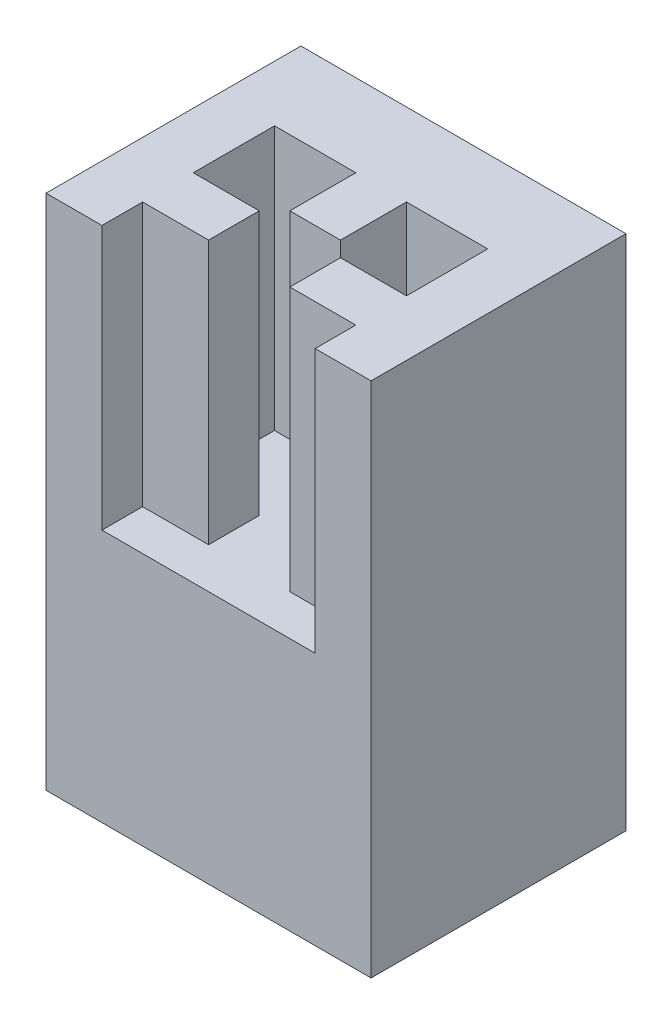
ISO-10303-21;
HEADER;
FILE_DESCRIPTION(('STEP AP214'),'2;1');
FILE_NAME('part.step','',(''),(''),'','','');
FILE_SCHEMA(('AUTOMOTIVE_DESIGN { 1 0 10303 214 1 1 1 1 }'));
ENDSEC;
DATA;
#1=APPLICATION_CONTEXT('core data for automotive mechanical design processes');
#2=APPLICATION_PROTOCOL_DEFINITION('international standard','automotive_design',2000,#1);
#3=PRODUCT_CONTEXT('',#1,'mechanical');
#4=PRODUCT('Part','Part','',(#3));
#5=PRODUCT_RELATED_PRODUCT_CATEGORY('part','',(#4));
#6=PRODUCT_DEFINITION_FORMATION('','',#4);
#7=PRODUCT_DEFINITION_CONTEXT('part definition',#1,'design');
#8=PRODUCT_DEFINITION('design','',#6,#7);
#9=PRODUCT_DEFINITION_SHAPE('','',#8);
#10=(LENGTH_UNIT() NAMED_UNIT(*) SI_UNIT(.MILLI.,.METRE.));
#11=(NAMED_UNIT(*) PLANE_ANGLE_UNIT() SI_UNIT($,.RADIAN.));
#12=(NAMED_UNIT(*) SI_UNIT($,.STERADIAN.) SOLID_ANGLE_UNIT());
#13=UNCERTAINTY_MEASURE_WITH_UNIT(LENGTH_MEASURE(1.E-05),#10,'distance_accuracy_value','');
#14=(GEOMETRIC_REPRESENTATION_CONTEXT(3) GLOBAL_UNCERTAINTY_ASSIGNED_CONTEXT((#13)) GLOBAL_UNIT_ASSIGNED_CONTEXT((#10,
#11,#12)) REPRESENTATION_CONTEXT('',''));
#15=CARTESIAN_POINT('',(0.,0.,0.));
#16=DIRECTION('',(0.,0.,1.));
#17=DIRECTION('',(1.,0.,0.));
#18=AXIS2_PLACEMENT_3D('',#15,#16,#17);
#19=CARTESIAN_POINT('',(0.,49.,0.));
#20=DIRECTION('',(0.,1.,0.));
#21=DIRECTION('',(0.,0.,1.));
#22=AXIS2_PLACEMENT_3D('',#19,#20,#21);
#23=PLANE('',#22);
#24=DIRECTION('',(1.,0.,0.));
#25=VECTOR('',#24,1.);
#26=CARTESIAN_POINT('',(-20.3104790419162,49.,16.4730538922156));
#27=LINE('',#26,#25);
#28=CARTESIAN_POINT('',(-20.3104790419162,49.,16.4730538922156));
#29=VERTEX_POINT('',#28);
#30=CARTESIAN_POINT('',(-14.0604790419162,49.,16.4730538922156));
#31=VERTEX_POINT('',#30);
#32=EDGE_CURVE('E236',#29,#31,#27,.T.);
#33=ORIENTED_EDGE('',*,*,#32,.T.);
#34=DIRECTION('',(0.,0.,1.));
#35=VECTOR('',#34,1.);
#36=CARTESIAN_POINT('',(-14.0604790419162,49.,16.4730538922156));
#37=LINE('',#36,#35);
#38=CARTESIAN_POINT('',(-14.0604790419162,49.,20.3230538922156));
#39=VERTEX_POINT('',#38);
#40=EDGE_CURVE('E234',#31,#39,#37,.T.);
#41=ORIENTED_EDGE('',*,*,#40,.T.);
#42=DIRECTION('',(1.,0.,0.));
#43=VECTOR('',#42,1.);
#44=CARTESIAN_POINT('',(-39.5604790419162,49.,20.3230538922156));
#45=LINE('',#44,#43);
#46=CARTESIAN_POINT('',(-8.76047904191617,49.,20.3230538922156));
#47=VERTEX_POINT('',#46);
#48=EDGE_CURVE('E254',#39,#47,#45,.T.);
#49=ORIENTED_EDGE('',*,*,#48,.T.);
#50=DIRECTION('',(0.,0.,-1.));
#51=VECTOR('',#50,1.);
#52=CARTESIAN_POINT('',(-8.76047904191617,49.,-3.82694610778443));
#53=LINE('',#52,#51);
#54=CARTESIAN_POINT('',(-8.76047904191617,49.,-3.82694610778443));
#55=VERTEX_POINT('',#54);
#56=EDGE_CURVE('E246',#47,#55,#53,.T.);
#57=ORIENTED_EDGE('',*,*,#56,.T.);
#58=DIRECTION('',(-1.,0.,0.));
#59=VECTOR('',#58,1.);
#60=CARTESIAN_POINT('',(-39.5604790419162,49.,-3.82694610778443));
#61=LINE('',#60,#59);
#62=CARTESIAN_POINT('',(-39.5604790419162,49.,-3.82694610778443));
#63=VERTEX_POINT('',#62);
#64=EDGE_CURVE('E249',#55,#63,#61,.T.);
#65=ORIENTED_EDGE('',*,*,#64,.T.);
#66=DIRECTION('',(0.,0.,1.));
#67=VECTOR('',#66,1.);
#68=CARTESIAN_POINT('',(-39.5604790419162,49.,-3.82694610778443));
#69=LINE('',#68,#67);
#70=CARTESIAN_POINT('',(-39.5604790419162,49.,20.3230538922156));
#71=VERTEX_POINT('',#70);
#72=EDGE_CURVE('E252',#63,#71,#69,.T.);
#73=ORIENTED_EDGE('',*,*,#72,.T.);
#74=CARTESIAN_POINT('',(-34.2604790419162,49.,20.3230538922156));
#75=VERTEX_POINT('',#74);
#76=EDGE_CURVE('E255',#71,#75,#45,.T.);
#77=ORIENTED_EDGE('',*,*,#76,.T.);
#78=DIRECTION('',(0.,0.,-1.));
#79=VECTOR('',#78,1.);
#80=CARTESIAN_POINT('',(-34.2604790419162,49.,20.3230538922156));
#81=LINE('',#80,#79);
#82=CARTESIAN_POINT('',(-34.2604790419162,49.,16.4730538922156));
#83=VERTEX_POINT('',#82);
#84=EDGE_CURVE('E245',#75,#83,#81,.T.);
#85=ORIENTED_EDGE('',*,*,#84,.T.);
#86=DIRECTION('',(1.,0.,0.));
#87=VECTOR('',#86,1.);
#88=CARTESIAN_POINT('',(-34.2604790419162,49.,16.4730538922156));
#89=LINE('',#88,#87);
#90=CARTESIAN_POINT('',(-28.0104790419162,49.,16.4730538922156));
#91=VERTEX_POINT('',#90);
#92=EDGE_CURVE('E189',#83,#91,#89,.T.);
#93=ORIENTED_EDGE('',*,*,#92,.T.);
#94=DIRECTION('',(0.,0.,-1.));
#95=VECTOR('',#94,1.);
#96=CARTESIAN_POINT('',(-28.0104790419162,49.,16.4730538922156));
#97=LINE('',#96,#95);
#98=CARTESIAN_POINT('',(-28.0104790419162,49.,11.6730538922156));
#99=VERTEX_POINT('',#98);
#100=EDGE_CURVE('E322',#91,#99,#97,.T.);
#101=ORIENTED_EDGE('',*,*,#100,.T.);
#102=DIRECTION('',(-1.,0.,0.));
#103=VECTOR('',#102,1.);
#104=CARTESIAN_POINT('',(-28.0104790419162,49.,11.6730538922156));
#105=LINE('',#104,#103);
#106=CARTESIAN_POINT('',(-34.2604790419162,49.,11.6730538922156));
#107=VERTEX_POINT('',#106);
#108=EDGE_CURVE('E324',#99,#107,#105,.T.);
#109=ORIENTED_EDGE('',*,*,#108,.T.);
#110=DIRECTION('',(0.,0.,-1.));
#111=VECTOR('',#110,1.);
#112=CARTESIAN_POINT('',(-34.2604790419162,49.,11.6730538922156));
#113=LINE('',#112,#111);
#114=CARTESIAN_POINT('',(-34.2604790419162,49.,3.97305389221557));
#115=VERTEX_POINT('',#114);
#116=EDGE_CURVE('E326',#107,#115,#113,.T.);
#117=ORIENTED_EDGE('',*,*,#116,.T.);
#118=DIRECTION('',(1.,0.,0.));
#119=VECTOR('',#118,1.);
#120=CARTESIAN_POINT('',(-34.2604790419162,49.,3.97305389221557));
#121=LINE('',#120,#119);
#122=CARTESIAN_POINT('',(-26.5604790419162,49.,3.97305389221557));
#123=VERTEX_POINT('',#122);
#124=EDGE_CURVE('E328',#115,#123,#121,.T.);
#125=ORIENTED_EDGE('',*,*,#124,.T.);
#126=DIRECTION('',(0.,0.,1.));
#127=VECTOR('',#126,1.);
#128=CARTESIAN_POINT('',(-26.5604790419162,49.,3.97305389221557));
#129=LINE('',#128,#127);
#130=CARTESIAN_POINT('',(-26.5604790419162,49.,10.2230538922156));
#131=VERTEX_POINT('',#130);
#132=EDGE_CURVE('E330',#123,#131,#129,.T.);
#133=ORIENTED_EDGE('',*,*,#132,.T.);
#134=DIRECTION('',(1.,0.,0.));
#135=VECTOR('',#134,1.);
#136=CARTESIAN_POINT('',(-26.5604790419162,49.,10.2230538922156));
#137=LINE('',#136,#135);
#138=CARTESIAN_POINT('',(-21.7604790419162,49.,10.2230538922156));
#139=VERTEX_POINT('',#138);
#140=EDGE_CURVE('E332',#131,#139,#137,.T.);
#141=ORIENTED_EDGE('',*,*,#140,.T.);
#142=DIRECTION('',(0.,0.,-1.));
#143=VECTOR('',#142,1.);
#144=CARTESIAN_POINT('',(-21.7604790419162,49.,10.2230538922156));
#145=LINE('',#144,#143);
#146=CARTESIAN_POINT('',(-21.7604790419162,49.,3.97305389221557));
#147=VERTEX_POINT('',#146);
#148=EDGE_CURVE('E334',#139,#147,#145,.T.);
#149=ORIENTED_EDGE('',*,*,#148,.T.);
#150=DIRECTION('',(1.,0.,0.));
#151=VECTOR('',#150,1.);
#152=CARTESIAN_POINT('',(-21.7604790419162,49.,3.97305389221557));
#153=LINE('',#152,#151);
#154=CARTESIAN_POINT('',(-14.0604790419162,49.,3.97305389221557));
#155=VERTEX_POINT('',#154);
#156=EDGE_CURVE('E336',#147,#155,#153,.T.);
#157=ORIENTED_EDGE('',*,*,#156,.T.);
#158=DIRECTION('',(0.,0.,1.));
#159=VECTOR('',#158,1.);
#160=CARTESIAN_POINT('',(-14.0604790419162,49.,3.97305389221557));
#161=LINE('',#160,#159);
#162=CARTESIAN_POINT('',(-14.0604790419162,49.,11.6730538922156));
#163=VERTEX_POINT('',#162);
#164=EDGE_CURVE('E338',#155,#163,#161,.T.);
#165=ORIENTED_EDGE('',*,*,#164,.T.);
#166=DIRECTION('',(-1.,0.,0.));
#167=VECTOR('',#166,1.);
#168=CARTESIAN_POINT('',(-14.0604790419162,49.,11.6730538922156));
#169=LINE('',#168,#167);
#170=CARTESIAN_POINT('',(-20.3104790419162,49.,11.6730538922156));
#171=VERTEX_POINT('',#170);
#172=EDGE_CURVE('E340',#163,#171,#169,.T.);
#173=ORIENTED_EDGE('',*,*,#172,.T.);
#174=DIRECTION('',(0.,0.,1.));
#175=VECTOR('',#174,1.);
#176=CARTESIAN_POINT('',(-20.3104790419162,49.,11.6730538922156));
#177=LINE('',#176,#175);
#178=EDGE_CURVE('E342',#171,#29,#177,.T.);
#179=ORIENTED_EDGE('',*,*,#178,.T.);
#180=EDGE_LOOP('',(#33,#41,#49,#57,#65,#73,#77,#85,#93,#101,#109,#117,#125,#133,#141,#149,#157,
#165,#173,#179));
#181=FACE_BOUND('',#180,.T.);
#182=ADVANCED_FACE('F33',(#181),#23,.T.);
#183=CARTESIAN_POINT('',(-8.76047904191617,49.,-3.82694610778443));
#184=DIRECTION('',(-1.,0.,0.));
#185=DIRECTION('',(0.,0.,1.));
#186=AXIS2_PLACEMENT_3D('',#183,#184,#185);
#187=PLANE('',#186);
#188=DIRECTION('',(0.,0.,-1.));
#189=VECTOR('',#188,1.);
#190=CARTESIAN_POINT('',(-8.76047904191617,0.,-3.82694610778443));
#191=LINE('',#190,#189);
#192=CARTESIAN_POINT('',(-8.76047904191617,0.,20.3230538922156));
#193=VERTEX_POINT('',#192);
#194=CARTESIAN_POINT('',(-8.76047904191617,0.,-3.82694610778443));
#195=VERTEX_POINT('',#194);
#196=EDGE_CURVE('E241',#193,#195,#191,.T.);
#197=ORIENTED_EDGE('',*,*,#196,.T.);
#198=DIRECTION('',(0.,-1.,0.));
#199=VECTOR('',#198,1.);
#200=CARTESIAN_POINT('',(-8.76047904191617,49.,-3.82694610778443));
#201=LINE('',#200,#199);
#202=EDGE_CURVE('E11',#55,#195,#201,.T.);
#203=ORIENTED_EDGE('',*,*,#202,.F.);
#204=ORIENTED_EDGE('',*,*,#56,.F.);
#205=DIRECTION('',(0.,-1.,0.));
#206=VECTOR('',#205,1.);
#207=CARTESIAN_POINT('',(-8.76047904191617,49.,20.3230538922156));
#208=LINE('',#207,#206);
#209=EDGE_CURVE('E258',#47,#193,#208,.T.);
#210=ORIENTED_EDGE('',*,*,#209,.T.);
#211=EDGE_LOOP('',(#197,#203,#204,#210));
#212=FACE_BOUND('',#211,.T.);
#213=ADVANCED_FACE('F35',(#212),#187,.F.);
#214=CARTESIAN_POINT('',(-39.5604790419162,49.,-3.82694610778443));
#215=DIRECTION('',(0.,0.,1.));
#216=DIRECTION('',(1.,0.,0.));
#217=AXIS2_PLACEMENT_3D('',#214,#215,#216);
#218=PLANE('',#217);
#219=DIRECTION('',(-1.,0.,0.));
#220=VECTOR('',#219,1.);
#221=CARTESIAN_POINT('',(-39.5604790419162,0.,-3.82694610778443));
#222=LINE('',#221,#220);
#223=CARTESIAN_POINT('',(-39.5604790419162,0.,-3.82694610778443));
#224=VERTEX_POINT('',#223);
#225=EDGE_CURVE('E261',#195,#224,#222,.T.);
#226=ORIENTED_EDGE('',*,*,#225,.T.);
#227=DIRECTION('',(0.,-1.,0.));
#228=VECTOR('',#227,1.);
#229=CARTESIAN_POINT('',(-39.5604790419162,49.,-3.82694610778443));
#230=LINE('',#229,#228);
#231=EDGE_CURVE('E41',#63,#224,#230,.T.);
#232=ORIENTED_EDGE('',*,*,#231,.F.);
#233=ORIENTED_EDGE('',*,*,#64,.F.);
#234=ORIENTED_EDGE('',*,*,#202,.T.);
#235=EDGE_LOOP('',(#226,#232,#233,#234));
#236=FACE_BOUND('',#235,.T.);
#237=ADVANCED_FACE('F413',(#236),#218,.F.);
#238=CARTESIAN_POINT('',(-39.5604790419162,49.,-3.82694610778443));
#239=DIRECTION('',(1.,0.,0.));
#240=DIRECTION('',(0.,0.,-1.));
#241=AXIS2_PLACEMENT_3D('',#238,#239,#240);
#242=PLANE('',#241);
#243=DIRECTION('',(0.,0.,1.));
#244=VECTOR('',#243,1.);
#245=CARTESIAN_POINT('',(-39.5604790419162,0.,-3.82694610778443));
#246=LINE('',#245,#244);
#247=CARTESIAN_POINT('',(-39.5604790419162,0.,20.3230538922156));
#248=VERTEX_POINT('',#247);
#249=EDGE_CURVE('E263',#224,#248,#246,.T.);
#250=ORIENTED_EDGE('',*,*,#249,.T.);
#251=DIRECTION('',(0.,-1.,0.));
#252=VECTOR('',#251,1.);
#253=CARTESIAN_POINT('',(-39.5604790419162,49.,20.3230538922156));
#254=LINE('',#253,#252);
#255=EDGE_CURVE('E268',#71,#248,#254,.T.);
#256=ORIENTED_EDGE('',*,*,#255,.F.);
#257=ORIENTED_EDGE('',*,*,#72,.F.);
#258=ORIENTED_EDGE('',*,*,#231,.T.);
#259=EDGE_LOOP('',(#250,#256,#257,#258));
#260=FACE_BOUND('',#259,.T.);
#261=ADVANCED_FACE('F275',(#260),#242,.F.);
#262=CARTESIAN_POINT('',(-39.5604790419162,49.,20.3230538922156));
#263=DIRECTION('',(0.,0.,-1.));
#264=DIRECTION('',(-1.,0.,0.));
#265=AXIS2_PLACEMENT_3D('',#262,#263,#264);
#266=PLANE('',#265);
#267=ORIENTED_EDGE('',*,*,#48,.F.);
#268=DIRECTION('',(0.,-1.,0.));
#269=VECTOR('',#268,1.);
#270=CARTESIAN_POINT('',(-14.0604790419162,188.640673273356,20.3230538922156));
#271=LINE('',#270,#269);
#272=CARTESIAN_POINT('',(-14.0604790419162,24.,20.3230538922156));
#273=VERTEX_POINT('',#272);
#274=EDGE_CURVE('E48',#39,#273,#271,.T.);
#275=ORIENTED_EDGE('',*,*,#274,.T.);
#276=DIRECTION('',(1.,0.,0.));
#277=VECTOR('',#276,1.);
#278=CARTESIAN_POINT('',(-39.5604790419162,24.,20.3230538922156));
#279=LINE('',#278,#277);
#280=CARTESIAN_POINT('',(-34.2604790419162,24.,20.3230538922156));
#281=VERTEX_POINT('',#280);
#282=EDGE_CURVE('E52',#281,#273,#279,.T.);
#283=ORIENTED_EDGE('',*,*,#282,.F.);
#284=DIRECTION('',(0.,-1.,0.));
#285=VECTOR('',#284,1.);
#286=CARTESIAN_POINT('',(-34.2604790419162,188.640673273356,20.3230538922156));
#287=LINE('',#286,#285);
#288=EDGE_CURVE('E175',#75,#281,#287,.T.);
#289=ORIENTED_EDGE('',*,*,#288,.F.);
#290=ORIENTED_EDGE('',*,*,#76,.F.);
#291=ORIENTED_EDGE('',*,*,#255,.T.);
#292=DIRECTION('',(1.,0.,0.));
#293=VECTOR('',#292,1.);
#294=CARTESIAN_POINT('',(-39.5604790419162,0.,20.3230538922156));
#295=LINE('',#294,#293);
#296=EDGE_CURVE('E250',#248,#193,#295,.T.);
#297=ORIENTED_EDGE('',*,*,#296,.T.);
#298=ORIENTED_EDGE('',*,*,#209,.F.);
#299=EDGE_LOOP('',(#267,#275,#283,#289,#290,#291,#297,#298));
#300=FACE_BOUND('',#299,.T.);
#301=ADVANCED_FACE('F283',(#300),#266,.F.);
#302=CARTESIAN_POINT('',(0.,0.,0.));
#303=DIRECTION('',(0.,1.,0.));
#304=DIRECTION('',(0.,0.,1.));
#305=AXIS2_PLACEMENT_3D('',#302,#303,#304);
#306=PLANE('',#305);
#307=CARTESIAN_POINT('',(-24.1604790419162,0.,8.32305389221557));
#308=DIRECTION('',(0.,-1.,0.));
#309=DIRECTION('',(0.,0.,-1.));
#310=AXIS2_PLACEMENT_3D('',#307,#308,#309);
#311=CIRCLE('',#310,7.5);
#312=CARTESIAN_POINT('',(-24.1604790419162,0.,0.823053892215577));
#313=VERTEX_POINT('',#312);
#314=EDGE_CURVE('E242',#313,#313,#311,.T.);
#315=ORIENTED_EDGE('',*,*,#314,.F.);
#316=EDGE_LOOP('',(#315));
#317=FACE_BOUND('',#316,.T.);
#318=ORIENTED_EDGE('',*,*,#196,.F.);
#319=ORIENTED_EDGE('',*,*,#296,.F.);
#320=ORIENTED_EDGE('',*,*,#249,.F.);
#321=ORIENTED_EDGE('',*,*,#225,.F.);
#322=EDGE_LOOP('',(#318,#319,#320,#321));
#323=FACE_BOUND('',#322,.T.);
#324=ADVANCED_FACE('F281',(#317,#323),#306,.F.);
#325=CARTESIAN_POINT('',(-24.1604790419162,18.,8.32305389221557));
#326=DIRECTION('',(0.,-1.,0.));
#327=DIRECTION('',(0.,0.,-1.));
#328=AXIS2_PLACEMENT_3D('',#325,#326,#327);
#329=CYLINDRICAL_SURFACE('',#328,7.5);
#330=CARTESIAN_POINT('',(-24.1604790419162,18.,8.32305389221557));
#331=DIRECTION('',(0.,-1.,0.));
#332=DIRECTION('',(0.,0.,-1.));
#333=AXIS2_PLACEMENT_3D('',#330,#331,#332);
#334=CIRCLE('',#333,7.5);
#335=CARTESIAN_POINT('',(-24.1604790419162,18.,0.823053892215577));
#336=VERTEX_POINT('',#335);
#337=EDGE_CURVE('E238',#336,#336,#334,.T.);
#338=ORIENTED_EDGE('',*,*,#337,.F.);
#339=EDGE_LOOP('',(#338));
#340=FACE_BOUND('',#339,.T.);
#341=ORIENTED_EDGE('',*,*,#314,.T.);
#342=EDGE_LOOP('',(#341));
#343=FACE_BOUND('',#342,.T.);
#344=ADVANCED_FACE('F416',(#340,#343),#329,.F.);
#345=CARTESIAN_POINT('',(-24.1604790419162,18.,8.32305389221557));
#346=DIRECTION('',(0.,-1.,0.));
#347=DIRECTION('',(0.,0.,-1.));
#348=AXIS2_PLACEMENT_3D('',#345,#346,#347);
#349=PLANE('',#348);
#350=ORIENTED_EDGE('',*,*,#337,.T.);
#351=EDGE_LOOP('',(#350));
#352=FACE_BOUND('',#351,.T.);
#353=ADVANCED_FACE('F448',(#352),#349,.T.);
#354=CARTESIAN_POINT('',(-14.0604790419162,188.640673273356,16.4730538922156));
#355=DIRECTION('',(1.,0.,0.));
#356=DIRECTION('',(0.,0.,-1.));
#357=AXIS2_PLACEMENT_3D('',#354,#355,#356);
#358=PLANE('',#357);
#359=DIRECTION('',(0.,-1.,0.));
#360=VECTOR('',#359,1.);
#361=CARTESIAN_POINT('',(-14.0604790419162,188.640673273356,16.4730538922156));
#362=LINE('',#361,#360);
#363=CARTESIAN_POINT('',(-14.0604790419162,24.,16.4730538922156));
#364=VERTEX_POINT('',#363);
#365=EDGE_CURVE('E231',#31,#364,#362,.T.);
#366=ORIENTED_EDGE('',*,*,#365,.T.);
#367=DIRECTION('',(0.,0.,1.));
#368=VECTOR('',#367,1.);
#369=CARTESIAN_POINT('',(-14.0604790419162,24.,16.4730538922156));
#370=LINE('',#369,#368);
#371=EDGE_CURVE('E194',#364,#273,#370,.T.);
#372=ORIENTED_EDGE('',*,*,#371,.T.);
#373=ORIENTED_EDGE('',*,*,#274,.F.);
#374=ORIENTED_EDGE('',*,*,#40,.F.);
#375=EDGE_LOOP('',(#366,#372,#373,#374));
#376=FACE_BOUND('',#375,.T.);
#377=ADVANCED_FACE('F292',(#376),#358,.F.);
#378=CARTESIAN_POINT('',(-20.3104790419162,188.640673273356,16.4730538922156));
#379=DIRECTION('',(0.,0.,-1.));
#380=DIRECTION('',(-1.,0.,0.));
#381=AXIS2_PLACEMENT_3D('',#378,#379,#380);
#382=PLANE('',#381);
#383=DIRECTION('',(0.,-1.,0.));
#384=VECTOR('',#383,1.);
#385=CARTESIAN_POINT('',(-20.3104790419162,188.640673273356,16.4730538922156));
#386=LINE('',#385,#384);
#387=CARTESIAN_POINT('',(-20.3104790419162,24.,16.4730538922156));
#388=VERTEX_POINT('',#387);
#389=EDGE_CURVE('E227',#29,#388,#386,.T.);
#390=ORIENTED_EDGE('',*,*,#389,.T.);
#391=DIRECTION('',(1.,0.,0.));
#392=VECTOR('',#391,1.);
#393=CARTESIAN_POINT('',(-20.3104790419162,24.,16.4730538922156));
#394=LINE('',#393,#392);
#395=EDGE_CURVE('E296',#388,#364,#394,.T.);
#396=ORIENTED_EDGE('',*,*,#395,.T.);
#397=ORIENTED_EDGE('',*,*,#365,.F.);
#398=ORIENTED_EDGE('',*,*,#32,.F.);
#399=EDGE_LOOP('',(#390,#396,#397,#398));
#400=FACE_BOUND('',#399,.T.);
#401=ADVANCED_FACE('F348',(#400),#382,.F.);
#402=CARTESIAN_POINT('',(-20.3104790419162,188.640673273356,11.6730538922156));
#403=DIRECTION('',(1.,0.,0.));
#404=DIRECTION('',(0.,0.,-1.));
#405=AXIS2_PLACEMENT_3D('',#402,#403,#404);
#406=PLANE('',#405);
#407=DIRECTION('',(0.,-1.,0.));
#408=VECTOR('',#407,1.);
#409=CARTESIAN_POINT('',(-20.3104790419162,188.640673273356,11.6730538922156));
#410=LINE('',#409,#408);
#411=CARTESIAN_POINT('',(-20.3104790419162,24.,11.6730538922156));
#412=VERTEX_POINT('',#411);
#413=EDGE_CURVE('E224',#171,#412,#410,.T.);
#414=ORIENTED_EDGE('',*,*,#413,.T.);
#415=DIRECTION('',(0.,0.,1.));
#416=VECTOR('',#415,1.);
#417=CARTESIAN_POINT('',(-20.3104790419162,24.,11.6730538922156));
#418=LINE('',#417,#416);
#419=EDGE_CURVE('E297',#412,#388,#418,.T.);
#420=ORIENTED_EDGE('',*,*,#419,.T.);
#421=ORIENTED_EDGE('',*,*,#389,.F.);
#422=ORIENTED_EDGE('',*,*,#178,.F.);
#423=EDGE_LOOP('',(#414,#420,#421,#422));
#424=FACE_BOUND('',#423,.T.);
#425=ADVANCED_FACE('F350',(#424),#406,.F.);
#426=CARTESIAN_POINT('',(-14.0604790419162,188.640673273356,11.6730538922156));
#427=DIRECTION('',(0.,0.,1.));
#428=DIRECTION('',(1.,0.,0.));
#429=AXIS2_PLACEMENT_3D('',#426,#427,#428);
#430=PLANE('',#429);
#431=DIRECTION('',(0.,-1.,0.));
#432=VECTOR('',#431,1.);
#433=CARTESIAN_POINT('',(-14.0604790419162,188.640673273356,11.6730538922156));
#434=LINE('',#433,#432);
#435=CARTESIAN_POINT('',(-14.0604790419162,24.,11.6730538922156));
#436=VERTEX_POINT('',#435);
#437=EDGE_CURVE('E221',#163,#436,#434,.T.);
#438=ORIENTED_EDGE('',*,*,#437,.T.);
#439=DIRECTION('',(-1.,0.,0.));
#440=VECTOR('',#439,1.);
#441=CARTESIAN_POINT('',(-14.0604790419162,24.,11.6730538922156));
#442=LINE('',#441,#440);
#443=EDGE_CURVE('E301',#436,#412,#442,.T.);
#444=ORIENTED_EDGE('',*,*,#443,.T.);
#445=ORIENTED_EDGE('',*,*,#413,.F.);
#446=ORIENTED_EDGE('',*,*,#172,.F.);
#447=EDGE_LOOP('',(#438,#444,#445,#446));
#448=FACE_BOUND('',#447,.T.);
#449=ADVANCED_FACE('F359',(#448),#430,.F.);
#450=CARTESIAN_POINT('',(-14.0604790419162,188.640673273356,3.97305389221557));
#451=DIRECTION('',(1.,0.,0.));
#452=DIRECTION('',(0.,0.,-1.));
#453=AXIS2_PLACEMENT_3D('',#450,#451,#452);
#454=PLANE('',#453);
#455=DIRECTION('',(0.,-1.,0.));
#456=VECTOR('',#455,1.);
#457=CARTESIAN_POINT('',(-14.0604790419162,188.640673273356,3.97305389221557));
#458=LINE('',#457,#456);
#459=CARTESIAN_POINT('',(-14.0604790419162,24.,3.97305389221557));
#460=VERTEX_POINT('',#459);
#461=EDGE_CURVE('E218',#155,#460,#458,.T.);
#462=ORIENTED_EDGE('',*,*,#461,.T.);
#463=DIRECTION('',(0.,0.,1.));
#464=VECTOR('',#463,1.);
#465=CARTESIAN_POINT('',(-14.0604790419162,24.,3.97305389221557));
#466=LINE('',#465,#464);
#467=EDGE_CURVE('E303',#460,#436,#466,.T.);
#468=ORIENTED_EDGE('',*,*,#467,.T.);
#469=ORIENTED_EDGE('',*,*,#437,.F.);
#470=ORIENTED_EDGE('',*,*,#164,.F.);
#471=EDGE_LOOP('',(#462,#468,#469,#470));
#472=FACE_BOUND('',#471,.T.);
#473=ADVANCED_FACE('F362',(#472),#454,.F.);
#474=CARTESIAN_POINT('',(-21.7604790419162,188.640673273356,3.97305389221557));
#475=DIRECTION('',(0.,0.,-1.));
#476=DIRECTION('',(-1.,0.,0.));
#477=AXIS2_PLACEMENT_3D('',#474,#475,#476);
#478=PLANE('',#477);
#479=DIRECTION('',(0.,-1.,0.));
#480=VECTOR('',#479,1.);
#481=CARTESIAN_POINT('',(-21.7604790419162,188.640673273356,3.97305389221557));
#482=LINE('',#481,#480);
#483=CARTESIAN_POINT('',(-21.7604790419162,24.,3.97305389221557));
#484=VERTEX_POINT('',#483);
#485=EDGE_CURVE('E215',#147,#484,#482,.T.);
#486=ORIENTED_EDGE('',*,*,#485,.T.);
#487=DIRECTION('',(1.,0.,0.));
#488=VECTOR('',#487,1.);
#489=CARTESIAN_POINT('',(-21.7604790419162,24.,3.97305389221557));
#490=LINE('',#489,#488);
#491=EDGE_CURVE('E305',#484,#460,#490,.T.);
#492=ORIENTED_EDGE('',*,*,#491,.T.);
#493=ORIENTED_EDGE('',*,*,#461,.F.);
#494=ORIENTED_EDGE('',*,*,#156,.F.);
#495=EDGE_LOOP('',(#486,#492,#493,#494));
#496=FACE_BOUND('',#495,.T.);
#497=ADVANCED_FACE('F366',(#496),#478,.F.);
#498=CARTESIAN_POINT('',(-21.7604790419162,188.640673273356,10.2230538922156));
#499=DIRECTION('',(-1.,0.,0.));
#500=DIRECTION('',(0.,0.,1.));
#501=AXIS2_PLACEMENT_3D('',#498,#499,#500);
#502=PLANE('',#501);
#503=DIRECTION('',(0.,-1.,0.));
#504=VECTOR('',#503,1.);
#505=CARTESIAN_POINT('',(-21.7604790419162,188.640673273356,10.2230538922156));
#506=LINE('',#505,#504);
#507=CARTESIAN_POINT('',(-21.7604790419162,24.,10.2230538922156));
#508=VERTEX_POINT('',#507);
#509=EDGE_CURVE('E212',#139,#508,#506,.T.);
#510=ORIENTED_EDGE('',*,*,#509,.T.);
#511=DIRECTION('',(0.,0.,-1.));
#512=VECTOR('',#511,1.);
#513=CARTESIAN_POINT('',(-21.7604790419162,24.,10.2230538922156));
#514=LINE('',#513,#512);
#515=EDGE_CURVE('E307',#508,#484,#514,.T.);
#516=ORIENTED_EDGE('',*,*,#515,.T.);
#517=ORIENTED_EDGE('',*,*,#485,.F.);
#518=ORIENTED_EDGE('',*,*,#148,.F.);
#519=EDGE_LOOP('',(#510,#516,#517,#518));
#520=FACE_BOUND('',#519,.T.);
#521=ADVANCED_FACE('F374',(#520),#502,.F.);
#522=CARTESIAN_POINT('',(-26.5604790419162,188.640673273356,10.2230538922156));
#523=DIRECTION('',(0.,0.,-1.));
#524=DIRECTION('',(-1.,0.,0.));
#525=AXIS2_PLACEMENT_3D('',#522,#523,#524);
#526=PLANE('',#525);
#527=DIRECTION('',(0.,-1.,0.));
#528=VECTOR('',#527,1.);
#529=CARTESIAN_POINT('',(-26.5604790419162,188.640673273356,10.2230538922156));
#530=LINE('',#529,#528);
#531=CARTESIAN_POINT('',(-26.5604790419162,24.,10.2230538922156));
#532=VERTEX_POINT('',#531);
#533=EDGE_CURVE('E209',#131,#532,#530,.T.);
#534=ORIENTED_EDGE('',*,*,#533,.T.);
#535=DIRECTION('',(1.,0.,0.));
#536=VECTOR('',#535,1.);
#537=CARTESIAN_POINT('',(-26.5604790419162,24.,10.2230538922156));
#538=LINE('',#537,#536);
#539=EDGE_CURVE('E309',#532,#508,#538,.T.);
#540=ORIENTED_EDGE('',*,*,#539,.T.);
#541=ORIENTED_EDGE('',*,*,#509,.F.);
#542=ORIENTED_EDGE('',*,*,#140,.F.);
#543=EDGE_LOOP('',(#534,#540,#541,#542));
#544=FACE_BOUND('',#543,.T.);
#545=ADVANCED_FACE('F377',(#544),#526,.F.);
#546=CARTESIAN_POINT('',(-26.5604790419162,188.640673273356,3.97305389221557));
#547=DIRECTION('',(1.,0.,0.));
#548=DIRECTION('',(0.,0.,-1.));
#549=AXIS2_PLACEMENT_3D('',#546,#547,#548);
#550=PLANE('',#549);
#551=DIRECTION('',(0.,-1.,0.));
#552=VECTOR('',#551,1.);
#553=CARTESIAN_POINT('',(-26.5604790419162,188.640673273356,3.97305389221557));
#554=LINE('',#553,#552);
#555=CARTESIAN_POINT('',(-26.5604790419162,24.,3.97305389221557));
#556=VERTEX_POINT('',#555);
#557=EDGE_CURVE('E206',#123,#556,#554,.T.);
#558=ORIENTED_EDGE('',*,*,#557,.T.);
#559=DIRECTION('',(0.,0.,1.));
#560=VECTOR('',#559,1.);
#561=CARTESIAN_POINT('',(-26.5604790419162,24.,3.97305389221557));
#562=LINE('',#561,#560);
#563=EDGE_CURVE('E311',#556,#532,#562,.T.);
#564=ORIENTED_EDGE('',*,*,#563,.T.);
#565=ORIENTED_EDGE('',*,*,#533,.F.);
#566=ORIENTED_EDGE('',*,*,#132,.F.);
#567=EDGE_LOOP('',(#558,#564,#565,#566));
#568=FACE_BOUND('',#567,.T.);
#569=ADVANCED_FACE('F381',(#568),#550,.F.);
#570=CARTESIAN_POINT('',(-34.2604790419162,188.640673273356,3.97305389221557));
#571=DIRECTION('',(0.,0.,-1.));
#572=DIRECTION('',(-1.,0.,0.));
#573=AXIS2_PLACEMENT_3D('',#570,#571,#572);
#574=PLANE('',#573);
#575=DIRECTION('',(0.,-1.,0.));
#576=VECTOR('',#575,1.);
#577=CARTESIAN_POINT('',(-34.2604790419162,188.640673273356,3.97305389221557));
#578=LINE('',#577,#576);
#579=CARTESIAN_POINT('',(-34.2604790419162,24.,3.97305389221557));
#580=VERTEX_POINT('',#579);
#581=EDGE_CURVE('E203',#115,#580,#578,.T.);
#582=ORIENTED_EDGE('',*,*,#581,.T.);
#583=DIRECTION('',(1.,0.,0.));
#584=VECTOR('',#583,1.);
#585=CARTESIAN_POINT('',(-34.2604790419162,24.,3.97305389221557));
#586=LINE('',#585,#584);
#587=EDGE_CURVE('E313',#580,#556,#586,.T.);
#588=ORIENTED_EDGE('',*,*,#587,.T.);
#589=ORIENTED_EDGE('',*,*,#557,.F.);
#590=ORIENTED_EDGE('',*,*,#124,.F.);
#591=EDGE_LOOP('',(#582,#588,#589,#590));
#592=FACE_BOUND('',#591,.T.);
#593=ADVANCED_FACE('F388',(#592),#574,.F.);
#594=CARTESIAN_POINT('',(-34.2604790419162,188.640673273356,11.6730538922156));
#595=DIRECTION('',(-1.,0.,0.));
#596=DIRECTION('',(0.,0.,1.));
#597=AXIS2_PLACEMENT_3D('',#594,#595,#596);
#598=PLANE('',#597);
#599=DIRECTION('',(0.,-1.,0.));
#600=VECTOR('',#599,1.);
#601=CARTESIAN_POINT('',(-34.2604790419162,188.640673273356,11.6730538922156));
#602=LINE('',#601,#600);
#603=CARTESIAN_POINT('',(-34.2604790419162,24.,11.6730538922156));
#604=VERTEX_POINT('',#603);
#605=EDGE_CURVE('E200',#107,#604,#602,.T.);
#606=ORIENTED_EDGE('',*,*,#605,.T.);
#607=DIRECTION('',(0.,0.,-1.));
#608=VECTOR('',#607,1.);
#609=CARTESIAN_POINT('',(-34.2604790419162,24.,11.6730538922156));
#610=LINE('',#609,#608);
#611=EDGE_CURVE('E315',#604,#580,#610,.T.);
#612=ORIENTED_EDGE('',*,*,#611,.T.);
#613=ORIENTED_EDGE('',*,*,#581,.F.);
#614=ORIENTED_EDGE('',*,*,#116,.F.);
#615=EDGE_LOOP('',(#606,#612,#613,#614));
#616=FACE_BOUND('',#615,.T.);
#617=ADVANCED_FACE('F391',(#616),#598,.F.);
#618=CARTESIAN_POINT('',(-28.0104790419162,188.640673273356,11.6730538922156));
#619=DIRECTION('',(0.,0.,1.));
#620=DIRECTION('',(1.,0.,0.));
#621=AXIS2_PLACEMENT_3D('',#618,#619,#620);
#622=PLANE('',#621);
#623=DIRECTION('',(0.,-1.,0.));
#624=VECTOR('',#623,1.);
#625=CARTESIAN_POINT('',(-28.0104790419162,188.640673273356,11.6730538922156));
#626=LINE('',#625,#624);
#627=CARTESIAN_POINT('',(-28.0104790419162,24.,11.6730538922156));
#628=VERTEX_POINT('',#627);
#629=EDGE_CURVE('E192',#99,#628,#626,.T.);
#630=ORIENTED_EDGE('',*,*,#629,.T.);
#631=DIRECTION('',(-1.,0.,0.));
#632=VECTOR('',#631,1.);
#633=CARTESIAN_POINT('',(-28.0104790419162,24.,11.6730538922156));
#634=LINE('',#633,#632);
#635=EDGE_CURVE('E317',#628,#604,#634,.T.);
#636=ORIENTED_EDGE('',*,*,#635,.T.);
#637=ORIENTED_EDGE('',*,*,#605,.F.);
#638=ORIENTED_EDGE('',*,*,#108,.F.);
#639=EDGE_LOOP('',(#630,#636,#637,#638));
#640=FACE_BOUND('',#639,.T.);
#641=ADVANCED_FACE('F395',(#640),#622,.F.);
#642=CARTESIAN_POINT('',(-28.0104790419162,188.640673273356,16.4730538922156));
#643=DIRECTION('',(-1.,0.,0.));
#644=DIRECTION('',(0.,0.,1.));
#645=AXIS2_PLACEMENT_3D('',#642,#643,#644);
#646=PLANE('',#645);
#647=DIRECTION('',(0.,-1.,0.));
#648=VECTOR('',#647,1.);
#649=CARTESIAN_POINT('',(-28.0104790419162,188.640673273356,16.4730538922156));
#650=LINE('',#649,#648);
#651=CARTESIAN_POINT('',(-28.0104790419162,24.,16.4730538922156));
#652=VERTEX_POINT('',#651);
#653=EDGE_CURVE('E190',#91,#652,#650,.T.);
#654=ORIENTED_EDGE('',*,*,#653,.T.);
#655=DIRECTION('',(0.,0.,-1.));
#656=VECTOR('',#655,1.);
#657=CARTESIAN_POINT('',(-28.0104790419162,24.,16.4730538922156));
#658=LINE('',#657,#656);
#659=EDGE_CURVE('E182',#652,#628,#658,.T.);
#660=ORIENTED_EDGE('',*,*,#659,.T.);
#661=ORIENTED_EDGE('',*,*,#629,.F.);
#662=ORIENTED_EDGE('',*,*,#100,.F.);
#663=EDGE_LOOP('',(#654,#660,#661,#662));
#664=FACE_BOUND('',#663,.T.);
#665=ADVANCED_FACE('F399',(#664),#646,.F.);
#666=CARTESIAN_POINT('',(-34.2604790419162,188.640673273356,16.4730538922156));
#667=DIRECTION('',(0.,0.,-1.));
#668=DIRECTION('',(-1.,0.,0.));
#669=AXIS2_PLACEMENT_3D('',#666,#667,#668);
#670=PLANE('',#669);
#671=DIRECTION('',(0.,-1.,0.));
#672=VECTOR('',#671,1.);
#673=CARTESIAN_POINT('',(-34.2604790419162,188.640673273356,16.4730538922156));
#674=LINE('',#673,#672);
#675=CARTESIAN_POINT('',(-34.2604790419162,24.,16.4730538922156));
#676=VERTEX_POINT('',#675);
#677=EDGE_CURVE('E174',#83,#676,#674,.T.);
#678=ORIENTED_EDGE('',*,*,#677,.T.);
#679=DIRECTION('',(1.,0.,0.));
#680=VECTOR('',#679,1.);
#681=CARTESIAN_POINT('',(-34.2604790419162,24.,16.4730538922156));
#682=LINE('',#681,#680);
#683=EDGE_CURVE('E177',#676,#652,#682,.T.);
#684=ORIENTED_EDGE('',*,*,#683,.T.);
#685=ORIENTED_EDGE('',*,*,#653,.F.);
#686=ORIENTED_EDGE('',*,*,#92,.F.);
#687=EDGE_LOOP('',(#678,#684,#685,#686));
#688=FACE_BOUND('',#687,.T.);
#689=ADVANCED_FACE('F188',(#688),#670,.F.);
#690=CARTESIAN_POINT('',(-34.2604790419162,188.640673273356,20.3230538922156));
#691=DIRECTION('',(-1.,0.,0.));
#692=DIRECTION('',(0.,0.,1.));
#693=AXIS2_PLACEMENT_3D('',#690,#691,#692);
#694=PLANE('',#693);
#695=ORIENTED_EDGE('',*,*,#288,.T.);
#696=DIRECTION('',(0.,0.,-1.));
#697=VECTOR('',#696,1.);
#698=CARTESIAN_POINT('',(-34.2604790419162,24.,20.3230538922156));
#699=LINE('',#698,#697);
#700=EDGE_CURVE('E169',#281,#676,#699,.T.);
#701=ORIENTED_EDGE('',*,*,#700,.T.);
#702=ORIENTED_EDGE('',*,*,#677,.F.);
#703=ORIENTED_EDGE('',*,*,#84,.F.);
#704=EDGE_LOOP('',(#695,#701,#702,#703));
#705=FACE_BOUND('',#704,.T.);
#706=ADVANCED_FACE('F171',(#705),#694,.F.);
#707=CARTESIAN_POINT('',(0.,24.,0.));
#708=DIRECTION('',(0.,1.,0.));
#709=DIRECTION('',(0.,0.,1.));
#710=AXIS2_PLACEMENT_3D('',#707,#708,#709);
#711=PLANE('',#710);
#712=ORIENTED_EDGE('',*,*,#683,.F.);
#713=ORIENTED_EDGE('',*,*,#700,.F.);
#714=ORIENTED_EDGE('',*,*,#282,.T.);
#715=ORIENTED_EDGE('',*,*,#371,.F.);
#716=ORIENTED_EDGE('',*,*,#395,.F.);
#717=ORIENTED_EDGE('',*,*,#419,.F.);
#718=ORIENTED_EDGE('',*,*,#443,.F.);
#719=ORIENTED_EDGE('',*,*,#467,.F.);
#720=ORIENTED_EDGE('',*,*,#491,.F.);
#721=ORIENTED_EDGE('',*,*,#515,.F.);
#722=ORIENTED_EDGE('',*,*,#539,.F.);
#723=ORIENTED_EDGE('',*,*,#563,.F.);
#724=ORIENTED_EDGE('',*,*,#587,.F.);
#725=ORIENTED_EDGE('',*,*,#611,.F.);
#726=ORIENTED_EDGE('',*,*,#635,.F.);
#727=ORIENTED_EDGE('',*,*,#659,.F.);
#728=EDGE_LOOP('',(#712,#713,#714,#715,#716,#717,#718,#719,#720,#721,#722,#723,#724,#725,#726,#727));
#729=FACE_BOUND('',#728,.T.);
#730=ADVANCED_FACE('F180',(#729),#711,.T.);
#731=CLOSED_SHELL('',(#182,#213,#237,#261,#301,#324,#344,#353,#377,#401,#425,#449,#473,#497,
#521,#545,#569,#593,#617,#641,#665,#689,#706,#730));
#732=MANIFOLD_SOLID_BREP('B2',#731);
#733=ADVANCED_BREP_SHAPE_REPRESENTATION('',(#18,#732),#14);
#734=SHAPE_DEFINITION_REPRESENTATION(#9,#733);
ENDSEC;
END-ISO-10303-21;
